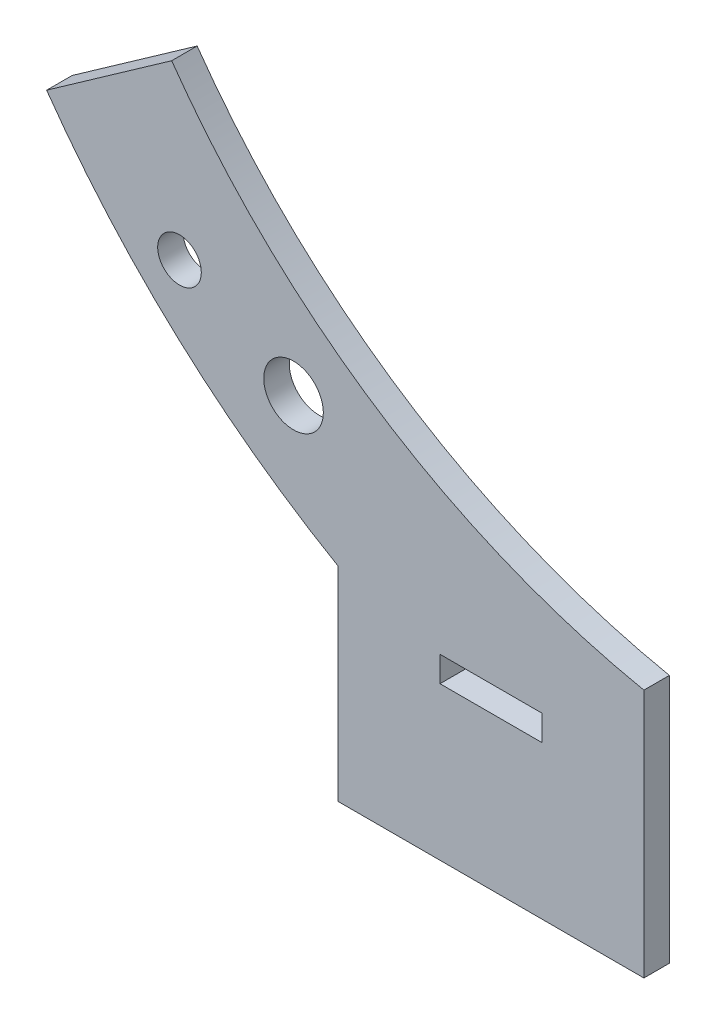
ISO-10303-21;
HEADER;
FILE_DESCRIPTION(('STEP AP214'),'2;1');
FILE_NAME('part.step','',(''),(''),'','','');
FILE_SCHEMA(('AUTOMOTIVE_DESIGN { 1 0 10303 214 1 1 1 1 }'));
ENDSEC;
DATA;
#1=APPLICATION_CONTEXT('core data for automotive mechanical design processes');
#2=APPLICATION_PROTOCOL_DEFINITION('international standard','automotive_design',2000,#1);
#3=PRODUCT_CONTEXT('',#1,'mechanical');
#4=PRODUCT('Part','Part','',(#3));
#5=PRODUCT_RELATED_PRODUCT_CATEGORY('part','',(#4));
#6=PRODUCT_DEFINITION_FORMATION('','',#4);
#7=PRODUCT_DEFINITION_CONTEXT('part definition',#1,'design');
#8=PRODUCT_DEFINITION('design','',#6,#7);
#9=PRODUCT_DEFINITION_SHAPE('','',#8);
#10=(LENGTH_UNIT() NAMED_UNIT(*) SI_UNIT(.MILLI.,.METRE.));
#11=(NAMED_UNIT(*) PLANE_ANGLE_UNIT() SI_UNIT($,.RADIAN.));
#12=(NAMED_UNIT(*) SI_UNIT($,.STERADIAN.) SOLID_ANGLE_UNIT());
#13=UNCERTAINTY_MEASURE_WITH_UNIT(LENGTH_MEASURE(1.E-05),#10,'distance_accuracy_value','');
#14=(GEOMETRIC_REPRESENTATION_CONTEXT(3) GLOBAL_UNCERTAINTY_ASSIGNED_CONTEXT((#13)) GLOBAL_UNIT_ASSIGNED_CONTEXT((#10,
#11,#12)) REPRESENTATION_CONTEXT('',''));
#15=CARTESIAN_POINT('',(0.,0.,0.));
#16=DIRECTION('',(0.,0.,1.));
#17=DIRECTION('',(1.,0.,0.));
#18=AXIS2_PLACEMENT_3D('',#15,#16,#17);
#19=CARTESIAN_POINT('',(0.,0.,3.175));
#20=DIRECTION('',(0.,0.,-1.));
#21=DIRECTION('',(-1.,0.,0.));
#22=AXIS2_PLACEMENT_3D('',#19,#20,#21);
#23=PLANE('',#22);
#24=CARTESIAN_POINT('',(0.,0.,3.175));
#25=DIRECTION('',(0.,0.,-1.));
#26=DIRECTION('',(-1.,0.,0.));
#27=AXIS2_PLACEMENT_3D('',#24,#25,#26);
#28=CIRCLE('',#27,95.25);
#29=CARTESIAN_POINT('',(-19.05,-93.3255592000391,3.175));
#30=VERTEX_POINT('',#29);
#31=CARTESIAN_POINT('',(-77.8816764613427,-54.8361830507079,3.175));
#32=VERTEX_POINT('',#31);
#33=EDGE_CURVE('E149',#30,#32,#28,.T.);
#34=ORIENTED_EDGE('',*,*,#33,.T.);
#35=DIRECTION('',(-0.817655395919608,-0.575707958537616,0.));
#36=VECTOR('',#35,1.);
#37=CARTESIAN_POINT('',(-93.4580117536112,-65.8034196608495,3.175));
#38=LINE('',#37,#36);
#39=CARTESIAN_POINT('',(-93.4580117536112,-65.8034196608495,3.175));
#40=VERTEX_POINT('',#39);
#41=EDGE_CURVE('E152',#32,#40,#38,.T.);
#42=ORIENTED_EDGE('',*,*,#41,.T.);
#43=CARTESIAN_POINT('',(0.,0.,3.175));
#44=DIRECTION('',(0.,0.,1.));
#45=DIRECTION('',(-1.,0.,0.));
#46=AXIS2_PLACEMENT_3D('',#43,#44,#45);
#47=CIRCLE('',#46,114.3);
#48=CARTESIAN_POINT('',(-57.15,-98.9867036525613,3.175));
#49=VERTEX_POINT('',#48);
#50=EDGE_CURVE('E155',#40,#49,#47,.T.);
#51=ORIENTED_EDGE('',*,*,#50,.T.);
#52=DIRECTION('',(0.,-1.,0.));
#53=VECTOR('',#52,1.);
#54=CARTESIAN_POINT('',(-57.15,-98.9867036525613,3.175));
#55=LINE('',#54,#53);
#56=CARTESIAN_POINT('',(-57.15,-124.386703652561,3.175));
#57=VERTEX_POINT('',#56);
#58=EDGE_CURVE('E157',#49,#57,#55,.T.);
#59=ORIENTED_EDGE('',*,*,#58,.T.);
#60=DIRECTION('',(1.,0.,0.));
#61=VECTOR('',#60,1.);
#62=CARTESIAN_POINT('',(-57.15,-124.386703652561,3.175));
#63=LINE('',#62,#61);
#64=CARTESIAN_POINT('',(-19.05,-124.386703652561,3.175));
#65=VERTEX_POINT('',#64);
#66=EDGE_CURVE('E159',#57,#65,#63,.T.);
#67=ORIENTED_EDGE('',*,*,#66,.T.);
#68=DIRECTION('',(0.,1.,0.));
#69=VECTOR('',#68,1.);
#70=CARTESIAN_POINT('',(-19.05,-124.386703652561,3.175));
#71=LINE('',#70,#69);
#72=EDGE_CURVE('E161',#65,#30,#71,.T.);
#73=ORIENTED_EDGE('',*,*,#72,.T.);
#74=EDGE_LOOP('',(#34,#42,#51,#59,#67,#73));
#75=FACE_BOUND('',#74,.T.);
#76=DIRECTION('',(0.,-1.,0.));
#77=VECTOR('',#76,1.);
#78=CARTESIAN_POINT('',(-44.45,-105.336703652561,3.175));
#79=LINE('',#78,#77);
#80=CARTESIAN_POINT('',(-44.45,-102.161703652561,3.175));
#81=VERTEX_POINT('',#80);
#82=CARTESIAN_POINT('',(-44.45,-105.336703652561,3.175));
#83=VERTEX_POINT('',#82);
#84=EDGE_CURVE('E110',#81,#83,#79,.T.);
#85=ORIENTED_EDGE('',*,*,#84,.F.);
#86=DIRECTION('',(-1.,0.,0.));
#87=VECTOR('',#86,1.);
#88=CARTESIAN_POINT('',(-44.45,-102.161703652561,3.175));
#89=LINE('',#88,#87);
#90=CARTESIAN_POINT('',(-31.75,-102.161703652561,3.175));
#91=VERTEX_POINT('',#90);
#92=EDGE_CURVE('E133',#91,#81,#89,.T.);
#93=ORIENTED_EDGE('',*,*,#92,.F.);
#94=DIRECTION('',(0.,1.,0.));
#95=VECTOR('',#94,1.);
#96=CARTESIAN_POINT('',(-31.75,-105.336703652561,3.175));
#97=LINE('',#96,#95);
#98=CARTESIAN_POINT('',(-31.75,-105.336703652561,3.175));
#99=VERTEX_POINT('',#98);
#100=EDGE_CURVE('E131',#99,#91,#97,.T.);
#101=ORIENTED_EDGE('',*,*,#100,.F.);
#102=DIRECTION('',(1.,0.,0.));
#103=VECTOR('',#102,1.);
#104=CARTESIAN_POINT('',(-44.45,-105.336703652561,3.175));
#105=LINE('',#104,#103);
#106=EDGE_CURVE('E118',#83,#99,#105,.T.);
#107=ORIENTED_EDGE('',*,*,#106,.F.);
#108=EDGE_LOOP('',(#85,#93,#101,#107));
#109=FACE_BOUND('',#108,.T.);
#110=CARTESIAN_POINT('',(-62.6970460783677,-83.3649154062464,3.175));
#111=DIRECTION('',(0.,0.,1.));
#112=DIRECTION('',(1.,0.,0.));
#113=AXIS2_PLACEMENT_3D('',#110,#111,#112);
#114=CIRCLE('',#113,3.71083254407268);
#115=CARTESIAN_POINT('',(-58.986213534295,-83.3649154062464,3.175));
#116=VERTEX_POINT('',#115);
#117=EDGE_CURVE('E139',#116,#116,#114,.T.);
#118=ORIENTED_EDGE('',*,*,#117,.F.);
#119=EDGE_LOOP('',(#118));
#120=FACE_BOUND('',#119,.T.);
#121=CARTESIAN_POINT('',(-76.9042335328174,-75.8372265311275,3.175));
#122=DIRECTION('',(0.,0.,1.));
#123=DIRECTION('',(1.,0.,0.));
#124=AXIS2_PLACEMENT_3D('',#121,#122,#123);
#125=CIRCLE('',#124,2.71553392045787);
#126=CARTESIAN_POINT('',(-74.1886996123595,-75.8372265311275,3.175));
#127=VERTEX_POINT('',#126);
#128=EDGE_CURVE('E254',#127,#127,#125,.T.);
#129=ORIENTED_EDGE('',*,*,#128,.F.);
#130=EDGE_LOOP('',(#129));
#131=FACE_BOUND('',#130,.T.);
#132=ADVANCED_FACE('F33',(#75,#109,#120,#131),#23,.F.);
#133=CARTESIAN_POINT('',(0.,0.,0.));
#134=DIRECTION('',(0.,0.,-1.));
#135=DIRECTION('',(-1.,0.,0.));
#136=AXIS2_PLACEMENT_3D('',#133,#134,#135);
#137=PLANE('',#136);
#138=CARTESIAN_POINT('',(-62.6970460783677,-83.3649154062464,0.));
#139=DIRECTION('',(0.,0.,1.));
#140=DIRECTION('',(1.,0.,0.));
#141=AXIS2_PLACEMENT_3D('',#138,#139,#140);
#142=CIRCLE('',#141,3.71083254407268);
#143=CARTESIAN_POINT('',(-58.986213534295,-83.3649154062464,0.));
#144=VERTEX_POINT('',#143);
#145=EDGE_CURVE('E260',#144,#144,#142,.T.);
#146=ORIENTED_EDGE('',*,*,#145,.T.);
#147=EDGE_LOOP('',(#146));
#148=FACE_BOUND('',#147,.T.);
#149=CARTESIAN_POINT('',(0.,0.,0.));
#150=DIRECTION('',(0.,0.,-1.));
#151=DIRECTION('',(-1.,0.,0.));
#152=AXIS2_PLACEMENT_3D('',#149,#150,#151);
#153=CIRCLE('',#152,95.25);
#154=CARTESIAN_POINT('',(-19.05,-93.3255592000391,0.));
#155=VERTEX_POINT('',#154);
#156=CARTESIAN_POINT('',(-77.8816764613427,-54.8361830507079,0.));
#157=VERTEX_POINT('',#156);
#158=EDGE_CURVE('E126',#155,#157,#153,.T.);
#159=ORIENTED_EDGE('',*,*,#158,.F.);
#160=DIRECTION('',(0.,1.,0.));
#161=VECTOR('',#160,1.);
#162=CARTESIAN_POINT('',(-19.05,-124.386703652561,0.));
#163=LINE('',#162,#161);
#164=CARTESIAN_POINT('',(-19.05,-124.386703652561,0.));
#165=VERTEX_POINT('',#164);
#166=EDGE_CURVE('E153',#165,#155,#163,.T.);
#167=ORIENTED_EDGE('',*,*,#166,.F.);
#168=DIRECTION('',(1.,0.,0.));
#169=VECTOR('',#168,1.);
#170=CARTESIAN_POINT('',(-57.15,-124.386703652561,0.));
#171=LINE('',#170,#169);
#172=CARTESIAN_POINT('',(-57.15,-124.386703652561,0.));
#173=VERTEX_POINT('',#172);
#174=EDGE_CURVE('E172',#173,#165,#171,.T.);
#175=ORIENTED_EDGE('',*,*,#174,.F.);
#176=DIRECTION('',(0.,-1.,0.));
#177=VECTOR('',#176,1.);
#178=CARTESIAN_POINT('',(-57.15,-98.9867036525613,0.));
#179=LINE('',#178,#177);
#180=CARTESIAN_POINT('',(-57.15,-98.9867036525613,0.));
#181=VERTEX_POINT('',#180);
#182=EDGE_CURVE('E170',#181,#173,#179,.T.);
#183=ORIENTED_EDGE('',*,*,#182,.F.);
#184=CARTESIAN_POINT('',(0.,0.,0.));
#185=DIRECTION('',(0.,0.,1.));
#186=DIRECTION('',(-1.,0.,0.));
#187=AXIS2_PLACEMENT_3D('',#184,#185,#186);
#188=CIRCLE('',#187,114.3);
#189=CARTESIAN_POINT('',(-93.4580117536112,-65.8034196608495,0.));
#190=VERTEX_POINT('',#189);
#191=EDGE_CURVE('E168',#190,#181,#188,.T.);
#192=ORIENTED_EDGE('',*,*,#191,.F.);
#193=DIRECTION('',(-0.817655395919608,-0.575707958537616,0.));
#194=VECTOR('',#193,1.);
#195=CARTESIAN_POINT('',(-93.4580117536112,-65.8034196608495,0.));
#196=LINE('',#195,#194);
#197=EDGE_CURVE('E166',#157,#190,#196,.T.);
#198=ORIENTED_EDGE('',*,*,#197,.F.);
#199=EDGE_LOOP('',(#159,#167,#175,#183,#192,#198));
#200=FACE_BOUND('',#199,.T.);
#201=DIRECTION('',(-1.,0.,0.));
#202=VECTOR('',#201,1.);
#203=CARTESIAN_POINT('',(-44.45,-102.161703652561,0.));
#204=LINE('',#203,#202);
#205=CARTESIAN_POINT('',(-31.75,-102.161703652561,0.));
#206=VERTEX_POINT('',#205);
#207=CARTESIAN_POINT('',(-44.45,-102.161703652561,0.));
#208=VERTEX_POINT('',#207);
#209=EDGE_CURVE('E119',#206,#208,#204,.T.);
#210=ORIENTED_EDGE('',*,*,#209,.T.);
#211=DIRECTION('',(0.,-1.,0.));
#212=VECTOR('',#211,1.);
#213=CARTESIAN_POINT('',(-44.45,-105.336703652561,0.));
#214=LINE('',#213,#212);
#215=CARTESIAN_POINT('',(-44.45,-105.336703652561,0.));
#216=VERTEX_POINT('',#215);
#217=EDGE_CURVE('E56',#208,#216,#214,.T.);
#218=ORIENTED_EDGE('',*,*,#217,.T.);
#219=DIRECTION('',(1.,0.,0.));
#220=VECTOR('',#219,1.);
#221=CARTESIAN_POINT('',(-44.45,-105.336703652561,0.));
#222=LINE('',#221,#220);
#223=CARTESIAN_POINT('',(-31.75,-105.336703652561,0.));
#224=VERTEX_POINT('',#223);
#225=EDGE_CURVE('E125',#216,#224,#222,.T.);
#226=ORIENTED_EDGE('',*,*,#225,.T.);
#227=DIRECTION('',(0.,1.,0.));
#228=VECTOR('',#227,1.);
#229=CARTESIAN_POINT('',(-31.75,-105.336703652561,0.));
#230=LINE('',#229,#228);
#231=EDGE_CURVE('E141',#224,#206,#230,.T.);
#232=ORIENTED_EDGE('',*,*,#231,.T.);
#233=EDGE_LOOP('',(#210,#218,#226,#232));
#234=FACE_BOUND('',#233,.T.);
#235=CARTESIAN_POINT('',(-76.9042335328174,-75.8372265311275,0.));
#236=DIRECTION('',(0.,0.,1.));
#237=DIRECTION('',(1.,0.,0.));
#238=AXIS2_PLACEMENT_3D('',#235,#236,#237);
#239=CIRCLE('',#238,2.71553392045787);
#240=CARTESIAN_POINT('',(-74.1886996123595,-75.8372265311275,0.));
#241=VERTEX_POINT('',#240);
#242=EDGE_CURVE('E257',#241,#241,#239,.T.);
#243=ORIENTED_EDGE('',*,*,#242,.T.);
#244=EDGE_LOOP('',(#243));
#245=FACE_BOUND('',#244,.T.);
#246=ADVANCED_FACE('F196',(#148,#200,#234,#245),#137,.T.);
#247=CARTESIAN_POINT('',(0.,0.,3.175));
#248=DIRECTION('',(0.,0.,-1.));
#249=DIRECTION('',(-1.,0.,0.));
#250=AXIS2_PLACEMENT_3D('',#247,#248,#249);
#251=CYLINDRICAL_SURFACE('',#250,95.25);
#252=ORIENTED_EDGE('',*,*,#158,.T.);
#253=DIRECTION('',(0.,0.,-1.));
#254=VECTOR('',#253,1.);
#255=CARTESIAN_POINT('',(-77.8816764613427,-54.8361830507079,3.175));
#256=LINE('',#255,#254);
#257=EDGE_CURVE('E11',#32,#157,#256,.T.);
#258=ORIENTED_EDGE('',*,*,#257,.F.);
#259=ORIENTED_EDGE('',*,*,#33,.F.);
#260=DIRECTION('',(0.,0.,-1.));
#261=VECTOR('',#260,1.);
#262=CARTESIAN_POINT('',(-19.05,-93.3255592000391,3.175));
#263=LINE('',#262,#261);
#264=EDGE_CURVE('E163',#30,#155,#263,.T.);
#265=ORIENTED_EDGE('',*,*,#264,.T.);
#266=EDGE_LOOP('',(#252,#258,#259,#265));
#267=FACE_BOUND('',#266,.T.);
#268=ADVANCED_FACE('F35',(#267),#251,.F.);
#269=CARTESIAN_POINT('',(-93.4580117536112,-65.8034196608495,3.175));
#270=DIRECTION('',(0.575707958537616,-0.817655395919608,0.));
#271=DIRECTION('',(0.817655395919608,0.575707958537616,0.));
#272=AXIS2_PLACEMENT_3D('',#269,#270,#271);
#273=PLANE('',#272);
#274=ORIENTED_EDGE('',*,*,#197,.T.);
#275=DIRECTION('',(0.,0.,-1.));
#276=VECTOR('',#275,1.);
#277=CARTESIAN_POINT('',(-93.4580117536112,-65.8034196608495,3.175));
#278=LINE('',#277,#276);
#279=EDGE_CURVE('E41',#40,#190,#278,.T.);
#280=ORIENTED_EDGE('',*,*,#279,.F.);
#281=ORIENTED_EDGE('',*,*,#41,.F.);
#282=ORIENTED_EDGE('',*,*,#257,.T.);
#283=EDGE_LOOP('',(#274,#280,#281,#282));
#284=FACE_BOUND('',#283,.T.);
#285=ADVANCED_FACE('F213',(#284),#273,.F.);
#286=CARTESIAN_POINT('',(0.,0.,3.175));
#287=DIRECTION('',(0.,0.,-1.));
#288=DIRECTION('',(-1.,0.,0.));
#289=AXIS2_PLACEMENT_3D('',#286,#287,#288);
#290=CYLINDRICAL_SURFACE('',#289,114.3);
#291=ORIENTED_EDGE('',*,*,#191,.T.);
#292=DIRECTION('',(0.,0.,-1.));
#293=VECTOR('',#292,1.);
#294=CARTESIAN_POINT('',(-57.15,-98.9867036525613,3.175));
#295=LINE('',#294,#293);
#296=EDGE_CURVE('E183',#49,#181,#295,.T.);
#297=ORIENTED_EDGE('',*,*,#296,.F.);
#298=ORIENTED_EDGE('',*,*,#50,.F.);
#299=ORIENTED_EDGE('',*,*,#279,.T.);
#300=EDGE_LOOP('',(#291,#297,#298,#299));
#301=FACE_BOUND('',#300,.T.);
#302=ADVANCED_FACE('F190',(#301),#290,.T.);
#303=CARTESIAN_POINT('',(-57.15,-98.9867036525613,3.175));
#304=DIRECTION('',(1.,0.,0.));
#305=DIRECTION('',(0.,0.,-1.));
#306=AXIS2_PLACEMENT_3D('',#303,#304,#305);
#307=PLANE('',#306);
#308=ORIENTED_EDGE('',*,*,#182,.T.);
#309=DIRECTION('',(0.,0.,-1.));
#310=VECTOR('',#309,1.);
#311=CARTESIAN_POINT('',(-57.15,-124.386703652561,3.175));
#312=LINE('',#311,#310);
#313=EDGE_CURVE('E180',#57,#173,#312,.T.);
#314=ORIENTED_EDGE('',*,*,#313,.F.);
#315=ORIENTED_EDGE('',*,*,#58,.F.);
#316=ORIENTED_EDGE('',*,*,#296,.T.);
#317=EDGE_LOOP('',(#308,#314,#315,#316));
#318=FACE_BOUND('',#317,.T.);
#319=ADVANCED_FACE('F202',(#318),#307,.F.);
#320=CARTESIAN_POINT('',(-57.15,-124.386703652561,3.175));
#321=DIRECTION('',(0.,1.,0.));
#322=DIRECTION('',(0.,0.,1.));
#323=AXIS2_PLACEMENT_3D('',#320,#321,#322);
#324=PLANE('',#323);
#325=ORIENTED_EDGE('',*,*,#174,.T.);
#326=DIRECTION('',(0.,0.,-1.));
#327=VECTOR('',#326,1.);
#328=CARTESIAN_POINT('',(-19.05,-124.386703652561,3.175));
#329=LINE('',#328,#327);
#330=EDGE_CURVE('E177',#65,#165,#329,.T.);
#331=ORIENTED_EDGE('',*,*,#330,.F.);
#332=ORIENTED_EDGE('',*,*,#66,.F.);
#333=ORIENTED_EDGE('',*,*,#313,.T.);
#334=EDGE_LOOP('',(#325,#331,#332,#333));
#335=FACE_BOUND('',#334,.T.);
#336=ADVANCED_FACE('F206',(#335),#324,.F.);
#337=CARTESIAN_POINT('',(-19.05,-124.386703652561,3.175));
#338=DIRECTION('',(-1.,0.,0.));
#339=DIRECTION('',(0.,0.,1.));
#340=AXIS2_PLACEMENT_3D('',#337,#338,#339);
#341=PLANE('',#340);
#342=ORIENTED_EDGE('',*,*,#166,.T.);
#343=ORIENTED_EDGE('',*,*,#264,.F.);
#344=ORIENTED_EDGE('',*,*,#72,.F.);
#345=ORIENTED_EDGE('',*,*,#330,.T.);
#346=EDGE_LOOP('',(#342,#343,#344,#345));
#347=FACE_BOUND('',#346,.T.);
#348=ADVANCED_FACE('F216',(#347),#341,.F.);
#349=CARTESIAN_POINT('',(-44.45,-105.336703652561,3.175));
#350=DIRECTION('',(1.,0.,0.));
#351=DIRECTION('',(0.,0.,-1.));
#352=AXIS2_PLACEMENT_3D('',#349,#350,#351);
#353=PLANE('',#352);
#354=ORIENTED_EDGE('',*,*,#217,.F.);
#355=DIRECTION('',(0.,0.,-1.));
#356=VECTOR('',#355,1.);
#357=CARTESIAN_POINT('',(-44.45,-102.161703652561,3.175));
#358=LINE('',#357,#356);
#359=EDGE_CURVE('E114',#81,#208,#358,.T.);
#360=ORIENTED_EDGE('',*,*,#359,.F.);
#361=ORIENTED_EDGE('',*,*,#84,.T.);
#362=DIRECTION('',(0.,0.,-1.));
#363=VECTOR('',#362,1.);
#364=CARTESIAN_POINT('',(-44.45,-105.336703652561,3.175));
#365=LINE('',#364,#363);
#366=EDGE_CURVE('E113',#83,#216,#365,.T.);
#367=ORIENTED_EDGE('',*,*,#366,.T.);
#368=EDGE_LOOP('',(#354,#360,#361,#367));
#369=FACE_BOUND('',#368,.T.);
#370=ADVANCED_FACE('F112',(#369),#353,.T.);
#371=CARTESIAN_POINT('',(-44.45,-105.336703652561,3.175));
#372=DIRECTION('',(0.,1.,0.));
#373=DIRECTION('',(0.,0.,1.));
#374=AXIS2_PLACEMENT_3D('',#371,#372,#373);
#375=PLANE('',#374);
#376=ORIENTED_EDGE('',*,*,#225,.F.);
#377=ORIENTED_EDGE('',*,*,#366,.F.);
#378=ORIENTED_EDGE('',*,*,#106,.T.);
#379=DIRECTION('',(0.,0.,-1.));
#380=VECTOR('',#379,1.);
#381=CARTESIAN_POINT('',(-31.75,-105.336703652561,3.175));
#382=LINE('',#381,#380);
#383=EDGE_CURVE('E127',#99,#224,#382,.T.);
#384=ORIENTED_EDGE('',*,*,#383,.T.);
#385=EDGE_LOOP('',(#376,#377,#378,#384));
#386=FACE_BOUND('',#385,.T.);
#387=ADVANCED_FACE('F122',(#386),#375,.T.);
#388=CARTESIAN_POINT('',(-31.75,-105.336703652561,3.175));
#389=DIRECTION('',(-1.,0.,0.));
#390=DIRECTION('',(0.,0.,1.));
#391=AXIS2_PLACEMENT_3D('',#388,#389,#390);
#392=PLANE('',#391);
#393=ORIENTED_EDGE('',*,*,#231,.F.);
#394=ORIENTED_EDGE('',*,*,#383,.F.);
#395=ORIENTED_EDGE('',*,*,#100,.T.);
#396=DIRECTION('',(0.,0.,-1.));
#397=VECTOR('',#396,1.);
#398=CARTESIAN_POINT('',(-31.75,-102.161703652561,3.175));
#399=LINE('',#398,#397);
#400=EDGE_CURVE('E48',#91,#206,#399,.T.);
#401=ORIENTED_EDGE('',*,*,#400,.T.);
#402=EDGE_LOOP('',(#393,#394,#395,#401));
#403=FACE_BOUND('',#402,.T.);
#404=ADVANCED_FACE('F235',(#403),#392,.T.);
#405=CARTESIAN_POINT('',(-44.45,-102.161703652561,3.175));
#406=DIRECTION('',(0.,-1.,0.));
#407=DIRECTION('',(0.,0.,-1.));
#408=AXIS2_PLACEMENT_3D('',#405,#406,#407);
#409=PLANE('',#408);
#410=ORIENTED_EDGE('',*,*,#209,.F.);
#411=ORIENTED_EDGE('',*,*,#400,.F.);
#412=ORIENTED_EDGE('',*,*,#92,.T.);
#413=ORIENTED_EDGE('',*,*,#359,.T.);
#414=EDGE_LOOP('',(#410,#411,#412,#413));
#415=FACE_BOUND('',#414,.T.);
#416=ADVANCED_FACE('F238',(#415),#409,.T.);
#417=CARTESIAN_POINT('',(-62.6970460783677,-83.3649154062464,3.175));
#418=DIRECTION('',(0.,0.,-1.));
#419=DIRECTION('',(-1.,0.,0.));
#420=AXIS2_PLACEMENT_3D('',#417,#418,#419);
#421=CYLINDRICAL_SURFACE('',#420,3.71083254407268);
#422=ORIENTED_EDGE('',*,*,#117,.T.);
#423=EDGE_LOOP('',(#422));
#424=FACE_BOUND('',#423,.T.);
#425=ORIENTED_EDGE('',*,*,#145,.F.);
#426=EDGE_LOOP('',(#425));
#427=FACE_BOUND('',#426,.T.);
#428=ADVANCED_FACE('F242',(#424,#427),#421,.F.);
#429=CARTESIAN_POINT('',(-76.9042335328174,-75.8372265311275,3.175));
#430=DIRECTION('',(0.,0.,-1.));
#431=DIRECTION('',(-1.,0.,0.));
#432=AXIS2_PLACEMENT_3D('',#429,#430,#431);
#433=CYLINDRICAL_SURFACE('',#432,2.71553392045787);
#434=ORIENTED_EDGE('',*,*,#128,.T.);
#435=EDGE_LOOP('',(#434));
#436=FACE_BOUND('',#435,.T.);
#437=ORIENTED_EDGE('',*,*,#242,.F.);
#438=EDGE_LOOP('',(#437));
#439=FACE_BOUND('',#438,.T.);
#440=ADVANCED_FACE('F245',(#436,#439),#433,.F.);
#441=CLOSED_SHELL('',(#132,#246,#268,#285,#302,#319,#336,#348,#370,#387,#404,#416,#428,#440));
#442=MANIFOLD_SOLID_BREP('B2',#441);
#443=ADVANCED_BREP_SHAPE_REPRESENTATION('',(#18,#442),#14);
#444=SHAPE_DEFINITION_REPRESENTATION(#9,#443);
ENDSEC;
END-ISO-10303-21;
